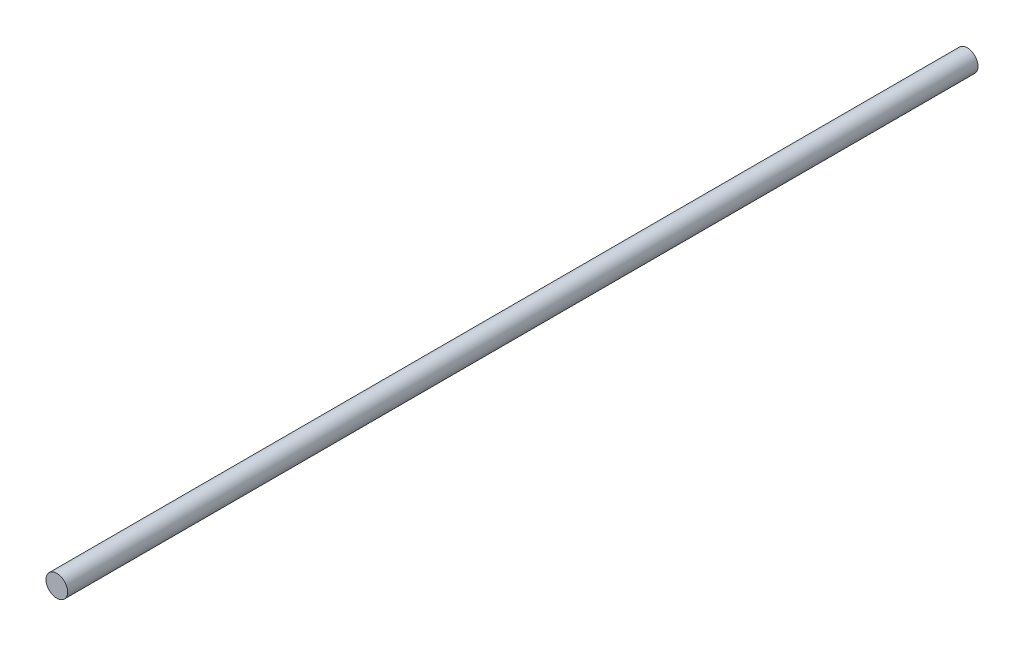
ISO-10303-21;
HEADER;
FILE_DESCRIPTION(('STEP AP214'),'2;1');
FILE_NAME('part.step','',(''),(''),'','','');
FILE_SCHEMA(('AUTOMOTIVE_DESIGN { 1 0 10303 214 1 1 1 1 }'));
ENDSEC;
DATA;
#1=APPLICATION_CONTEXT('core data for automotive mechanical design processes');
#2=APPLICATION_PROTOCOL_DEFINITION('international standard','automotive_design',2000,#1);
#3=PRODUCT_CONTEXT('',#1,'mechanical');
#4=PRODUCT('Part','Part','',(#3));
#5=PRODUCT_RELATED_PRODUCT_CATEGORY('part','',(#4));
#6=PRODUCT_DEFINITION_FORMATION('','',#4);
#7=PRODUCT_DEFINITION_CONTEXT('part definition',#1,'design');
#8=PRODUCT_DEFINITION('design','',#6,#7);
#9=PRODUCT_DEFINITION_SHAPE('','',#8);
#10=(LENGTH_UNIT() NAMED_UNIT(*) SI_UNIT(.MILLI.,.METRE.));
#11=(NAMED_UNIT(*) PLANE_ANGLE_UNIT() SI_UNIT($,.RADIAN.));
#12=(NAMED_UNIT(*) SI_UNIT($,.STERADIAN.) SOLID_ANGLE_UNIT());
#13=UNCERTAINTY_MEASURE_WITH_UNIT(LENGTH_MEASURE(1.E-05),#10,'distance_accuracy_value','');
#14=(GEOMETRIC_REPRESENTATION_CONTEXT(3) GLOBAL_UNCERTAINTY_ASSIGNED_CONTEXT((#13)) GLOBAL_UNIT_ASSIGNED_CONTEXT((#10,
#11,#12)) REPRESENTATION_CONTEXT('',''));
#15=CARTESIAN_POINT('',(0.,0.,0.));
#16=DIRECTION('',(0.,0.,1.));
#17=DIRECTION('',(1.,0.,0.));
#18=AXIS2_PLACEMENT_3D('',#15,#16,#17);
#19=CARTESIAN_POINT('',(0.,0.,337.));
#20=DIRECTION('',(0.,0.,-1.));
#21=DIRECTION('',(-1.,0.,0.));
#22=AXIS2_PLACEMENT_3D('',#19,#20,#21);
#23=CYLINDRICAL_SURFACE('',#22,4.);
#24=CARTESIAN_POINT('',(0.,0.,337.));
#25=DIRECTION('',(0.,0.,1.));
#26=DIRECTION('',(1.,0.,0.));
#27=AXIS2_PLACEMENT_3D('',#24,#25,#26);
#28=CIRCLE('',#27,4.);
#29=CARTESIAN_POINT('',(4.,0.,337.));
#30=VERTEX_POINT('',#29);
#31=EDGE_CURVE('E10',#30,#30,#28,.T.);
#32=ORIENTED_EDGE('',*,*,#31,.F.);
#33=EDGE_LOOP('',(#32));
#34=FACE_BOUND('',#33,.T.);
#35=CARTESIAN_POINT('',(0.,0.,0.));
#36=DIRECTION('',(0.,0.,1.));
#37=DIRECTION('',(1.,0.,0.));
#38=AXIS2_PLACEMENT_3D('',#35,#36,#37);
#39=CIRCLE('',#38,4.);
#40=CARTESIAN_POINT('',(4.,0.,0.));
#41=VERTEX_POINT('',#40);
#42=EDGE_CURVE('E36',#41,#41,#39,.T.);
#43=ORIENTED_EDGE('',*,*,#42,.T.);
#44=EDGE_LOOP('',(#43));
#45=FACE_BOUND('',#44,.T.);
#46=ADVANCED_FACE('F33',(#34,#45),#23,.T.);
#47=CARTESIAN_POINT('',(0.,0.,337.));
#48=DIRECTION('',(0.,0.,1.));
#49=DIRECTION('',(1.,0.,0.));
#50=AXIS2_PLACEMENT_3D('',#47,#48,#49);
#51=PLANE('',#50);
#52=ORIENTED_EDGE('',*,*,#31,.T.);
#53=EDGE_LOOP('',(#52));
#54=FACE_BOUND('',#53,.T.);
#55=ADVANCED_FACE('F48',(#54),#51,.T.);
#56=CARTESIAN_POINT('',(0.,0.,0.));
#57=DIRECTION('',(0.,0.,1.));
#58=DIRECTION('',(1.,0.,0.));
#59=AXIS2_PLACEMENT_3D('',#56,#57,#58);
#60=PLANE('',#59);
#61=ORIENTED_EDGE('',*,*,#42,.F.);
#62=EDGE_LOOP('',(#61));
#63=FACE_BOUND('',#62,.T.);
#64=ADVANCED_FACE('F46',(#63),#60,.F.);
#65=CLOSED_SHELL('',(#46,#55,#64));
#66=MANIFOLD_SOLID_BREP('B2',#65);
#67=ADVANCED_BREP_SHAPE_REPRESENTATION('',(#18,#66),#14);
#68=SHAPE_DEFINITION_REPRESENTATION(#9,#67);
ENDSEC;
END-ISO-10303-21;
